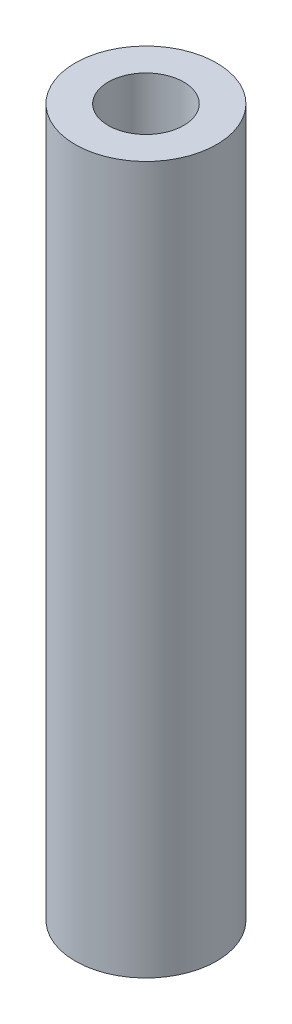
ISO-10303-21;
HEADER;
FILE_DESCRIPTION(('STEP AP214'),'2;1');
FILE_NAME('part.step','',(''),(''),'','','');
FILE_SCHEMA(('AUTOMOTIVE_DESIGN { 1 0 10303 214 1 1 1 1 }'));
ENDSEC;
DATA;
#1=APPLICATION_CONTEXT('core data for automotive mechanical design processes');
#2=APPLICATION_PROTOCOL_DEFINITION('international standard','automotive_design',2000,#1);
#3=PRODUCT_CONTEXT('',#1,'mechanical');
#4=PRODUCT('Part','Part','',(#3));
#5=PRODUCT_RELATED_PRODUCT_CATEGORY('part','',(#4));
#6=PRODUCT_DEFINITION_FORMATION('','',#4);
#7=PRODUCT_DEFINITION_CONTEXT('part definition',#1,'design');
#8=PRODUCT_DEFINITION('design','',#6,#7);
#9=PRODUCT_DEFINITION_SHAPE('','',#8);
#10=(LENGTH_UNIT() NAMED_UNIT(*) SI_UNIT(.MILLI.,.METRE.));
#11=(NAMED_UNIT(*) PLANE_ANGLE_UNIT() SI_UNIT($,.RADIAN.));
#12=(NAMED_UNIT(*) SI_UNIT($,.STERADIAN.) SOLID_ANGLE_UNIT());
#13=UNCERTAINTY_MEASURE_WITH_UNIT(LENGTH_MEASURE(1.E-05),#10,'distance_accuracy_value','');
#14=(GEOMETRIC_REPRESENTATION_CONTEXT(3) GLOBAL_UNCERTAINTY_ASSIGNED_CONTEXT((#13)) GLOBAL_UNIT_ASSIGNED_CONTEXT((#10,
#11,#12)) REPRESENTATION_CONTEXT('',''));
#15=CARTESIAN_POINT('',(0.,0.,0.));
#16=DIRECTION('',(0.,0.,1.));
#17=DIRECTION('',(1.,0.,0.));
#18=AXIS2_PLACEMENT_3D('',#15,#16,#17);
#19=CARTESIAN_POINT('',(0.,30.,0.));
#20=DIRECTION('',(0.,-1.,0.));
#21=DIRECTION('',(0.,0.,-1.));
#22=AXIS2_PLACEMENT_3D('',#19,#20,#21);
#23=CYLINDRICAL_SURFACE('',#22,3.);
#24=CARTESIAN_POINT('',(0.,30.,0.));
#25=DIRECTION('',(0.,1.,0.));
#26=DIRECTION('',(0.,0.,1.));
#27=AXIS2_PLACEMENT_3D('',#24,#25,#26);
#28=CIRCLE('',#27,3.);
#29=CARTESIAN_POINT('',(0.,30.,3.));
#30=VERTEX_POINT('',#29);
#31=EDGE_CURVE('E10',#30,#30,#28,.T.);
#32=ORIENTED_EDGE('',*,*,#31,.F.);
#33=EDGE_LOOP('',(#32));
#34=FACE_BOUND('',#33,.T.);
#35=CARTESIAN_POINT('',(0.,0.,0.));
#36=DIRECTION('',(0.,1.,0.));
#37=DIRECTION('',(0.,0.,1.));
#38=AXIS2_PLACEMENT_3D('',#35,#36,#37);
#39=CIRCLE('',#38,3.);
#40=CARTESIAN_POINT('',(0.,0.,3.));
#41=VERTEX_POINT('',#40);
#42=EDGE_CURVE('E40',#41,#41,#39,.T.);
#43=ORIENTED_EDGE('',*,*,#42,.T.);
#44=EDGE_LOOP('',(#43));
#45=FACE_BOUND('',#44,.T.);
#46=ADVANCED_FACE('F37',(#34,#45),#23,.T.);
#47=CARTESIAN_POINT('',(0.,30.,0.));
#48=DIRECTION('',(0.,1.,0.));
#49=DIRECTION('',(0.,0.,1.));
#50=AXIS2_PLACEMENT_3D('',#47,#48,#49);
#51=PLANE('',#50);
#52=CARTESIAN_POINT('',(0.,30.,0.));
#53=DIRECTION('',(0.,1.,0.));
#54=DIRECTION('',(0.,0.,1.));
#55=AXIS2_PLACEMENT_3D('',#52,#53,#54);
#56=CIRCLE('',#55,1.59999999999999);
#57=CARTESIAN_POINT('',(0.,30.,1.59999999999999));
#58=VERTEX_POINT('',#57);
#59=EDGE_CURVE('E54',#58,#58,#56,.T.);
#60=ORIENTED_EDGE('',*,*,#59,.F.);
#61=EDGE_LOOP('',(#60));
#62=FACE_BOUND('',#61,.T.);
#63=ORIENTED_EDGE('',*,*,#31,.T.);
#64=EDGE_LOOP('',(#63));
#65=FACE_BOUND('',#64,.T.);
#66=ADVANCED_FACE('F61',(#62,#65),#51,.T.);
#67=CARTESIAN_POINT('',(0.,0.,0.));
#68=DIRECTION('',(0.,1.,0.));
#69=DIRECTION('',(0.,0.,1.));
#70=AXIS2_PLACEMENT_3D('',#67,#68,#69);
#71=PLANE('',#70);
#72=CARTESIAN_POINT('',(0.,0.,0.));
#73=DIRECTION('',(0.,1.,0.));
#74=DIRECTION('',(0.,0.,1.));
#75=AXIS2_PLACEMENT_3D('',#72,#73,#74);
#76=CIRCLE('',#75,1.6);
#77=CARTESIAN_POINT('',(0.,0.,1.6));
#78=VERTEX_POINT('',#77);
#79=EDGE_CURVE('E49',#78,#78,#76,.T.);
#80=ORIENTED_EDGE('',*,*,#79,.T.);
#81=EDGE_LOOP('',(#80));
#82=FACE_BOUND('',#81,.T.);
#83=ORIENTED_EDGE('',*,*,#42,.F.);
#84=EDGE_LOOP('',(#83));
#85=FACE_BOUND('',#84,.T.);
#86=ADVANCED_FACE('F63',(#82,#85),#71,.F.);
#87=CARTESIAN_POINT('',(0.,30.,0.));
#88=DIRECTION('',(0.,1.,0.));
#89=DIRECTION('',(0.,0.,1.));
#90=AXIS2_PLACEMENT_3D('',#87,#88,#89);
#91=CYLINDRICAL_SURFACE('',#90,1.59999999999999);
#92=ORIENTED_EDGE('',*,*,#79,.F.);
#93=EDGE_LOOP('',(#92));
#94=FACE_BOUND('',#93,.T.);
#95=ORIENTED_EDGE('',*,*,#59,.T.);
#96=EDGE_LOOP('',(#95));
#97=FACE_BOUND('',#96,.T.);
#98=ADVANCED_FACE('F59',(#94,#97),#91,.F.);
#99=CLOSED_SHELL('',(#46,#66,#86,#98));
#100=MANIFOLD_SOLID_BREP('B2',#99);
#101=ADVANCED_BREP_SHAPE_REPRESENTATION('',(#18,#100),#14);
#102=SHAPE_DEFINITION_REPRESENTATION(#9,#101);
ENDSEC;
END-ISO-10303-21;
